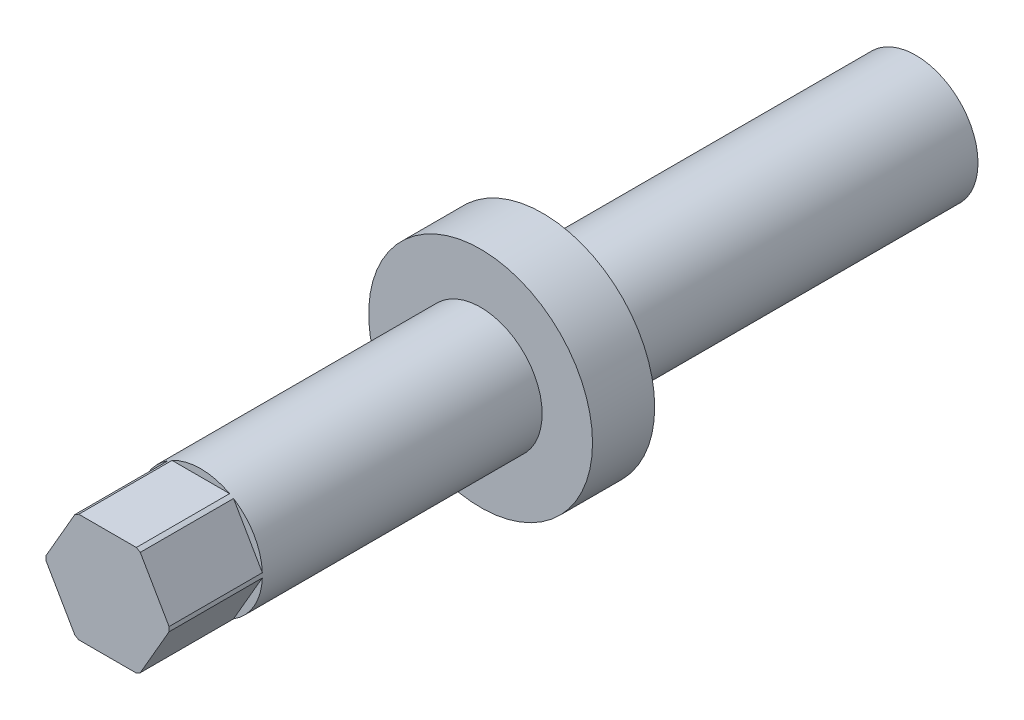
ISO-10303-21;
HEADER;
FILE_DESCRIPTION(('STEP AP214'),'2;1');
FILE_NAME('part.step','',(''),(''),'','','');
FILE_SCHEMA(('AUTOMOTIVE_DESIGN { 1 0 10303 214 1 1 1 1 }'));
ENDSEC;
DATA;
#1=APPLICATION_CONTEXT('core data for automotive mechanical design processes');
#2=APPLICATION_PROTOCOL_DEFINITION('international standard','automotive_design',2000,#1);
#3=PRODUCT_CONTEXT('',#1,'mechanical');
#4=PRODUCT('Part','Part','',(#3));
#5=PRODUCT_RELATED_PRODUCT_CATEGORY('part','',(#4));
#6=PRODUCT_DEFINITION_FORMATION('','',#4);
#7=PRODUCT_DEFINITION_CONTEXT('part definition',#1,'design');
#8=PRODUCT_DEFINITION('design','',#6,#7);
#9=PRODUCT_DEFINITION_SHAPE('','',#8);
#10=(LENGTH_UNIT() NAMED_UNIT(*) SI_UNIT(.MILLI.,.METRE.));
#11=(NAMED_UNIT(*) PLANE_ANGLE_UNIT() SI_UNIT($,.RADIAN.));
#12=(NAMED_UNIT(*) SI_UNIT($,.STERADIAN.) SOLID_ANGLE_UNIT());
#13=UNCERTAINTY_MEASURE_WITH_UNIT(LENGTH_MEASURE(1.E-05),#10,'distance_accuracy_value','');
#14=(GEOMETRIC_REPRESENTATION_CONTEXT(3) GLOBAL_UNCERTAINTY_ASSIGNED_CONTEXT((#13)) GLOBAL_UNIT_ASSIGNED_CONTEXT((#10,
#11,#12)) REPRESENTATION_CONTEXT('',''));
#15=CARTESIAN_POINT('',(0.,0.,0.));
#16=DIRECTION('',(0.,0.,1.));
#17=DIRECTION('',(1.,0.,0.));
#18=AXIS2_PLACEMENT_3D('',#15,#16,#17);
#19=CARTESIAN_POINT('',(0.,0.,0.));
#20=DIRECTION('',(0.,0.,-1.));
#21=DIRECTION('',(-1.,0.,0.));
#22=AXIS2_PLACEMENT_3D('',#19,#20,#21);
#23=PLANE('',#22);
#24=DIRECTION('',(-1.,0.,0.));
#25=VECTOR('',#24,1.);
#26=CARTESIAN_POINT('',(0.,5.55625,0.));
#27=LINE('',#26,#25);
#28=CARTESIAN_POINT('',(2.9407768000139,5.55625,0.));
#29=VERTEX_POINT('',#28);
#30=CARTESIAN_POINT('',(-2.9407768000139,5.55625,0.));
#31=VERTEX_POINT('',#30);
#32=EDGE_CURVE('E148',#29,#31,#27,.T.);
#33=ORIENTED_EDGE('',*,*,#32,.T.);
#34=CARTESIAN_POINT('',(0.,0.,0.));
#35=DIRECTION('',(0.,0.,1.));
#36=DIRECTION('',(1.,0.,0.));
#37=AXIS2_PLACEMENT_3D('',#34,#35,#36);
#38=CIRCLE('',#37,6.2865);
#39=CARTESIAN_POINT('',(-3.34146524977034,5.32491241567195,0.));
#40=VERTEX_POINT('',#39);
#41=EDGE_CURVE('E157',#31,#40,#38,.T.);
#42=ORIENTED_EDGE('',*,*,#41,.T.);
#43=DIRECTION('',(-0.5,-0.866025403784439,0.));
#44=VECTOR('',#43,1.);
#45=CARTESIAN_POINT('',(-4.81185364977729,2.778125,0.));
#46=LINE('',#45,#44);
#47=CARTESIAN_POINT('',(-6.28224204978424,0.231337584328054,0.));
#48=VERTEX_POINT('',#47);
#49=EDGE_CURVE('E168',#40,#48,#46,.T.);
#50=ORIENTED_EDGE('',*,*,#49,.T.);
#51=CARTESIAN_POINT('',(-6.28224204978424,-0.231337584328047,0.));
#52=VERTEX_POINT('',#51);
#53=EDGE_CURVE('E273',#48,#52,#38,.T.);
#54=ORIENTED_EDGE('',*,*,#53,.T.);
#55=DIRECTION('',(0.5,-0.866025403784439,0.));
#56=VECTOR('',#55,1.);
#57=CARTESIAN_POINT('',(-4.81185364977729,-2.778125,0.));
#58=LINE('',#57,#56);
#59=CARTESIAN_POINT('',(-3.34146524977034,-5.32491241567195,0.));
#60=VERTEX_POINT('',#59);
#61=EDGE_CURVE('E175',#52,#60,#58,.T.);
#62=ORIENTED_EDGE('',*,*,#61,.T.);
#63=CARTESIAN_POINT('',(-2.9407768000139,-5.55625,0.));
#64=VERTEX_POINT('',#63);
#65=EDGE_CURVE('E275',#60,#64,#38,.T.);
#66=ORIENTED_EDGE('',*,*,#65,.T.);
#67=DIRECTION('',(1.,0.,0.));
#68=VECTOR('',#67,1.);
#69=CARTESIAN_POINT('',(0.,-5.55625,0.));
#70=LINE('',#69,#68);
#71=CARTESIAN_POINT('',(2.9407768000139,-5.55625,0.));
#72=VERTEX_POINT('',#71);
#73=EDGE_CURVE('E207',#64,#72,#70,.T.);
#74=ORIENTED_EDGE('',*,*,#73,.T.);
#75=CARTESIAN_POINT('',(3.34146524977034,-5.32491241567195,0.));
#76=VERTEX_POINT('',#75);
#77=EDGE_CURVE('E233',#72,#76,#38,.T.);
#78=ORIENTED_EDGE('',*,*,#77,.T.);
#79=DIRECTION('',(0.5,0.866025403784439,0.));
#80=VECTOR('',#79,1.);
#81=CARTESIAN_POINT('',(4.81185364977729,-2.778125,0.));
#82=LINE('',#81,#80);
#83=CARTESIAN_POINT('',(6.28224204978424,-0.231337584328054,0.));
#84=VERTEX_POINT('',#83);
#85=EDGE_CURVE('E194',#76,#84,#82,.T.);
#86=ORIENTED_EDGE('',*,*,#85,.T.);
#87=CARTESIAN_POINT('',(6.28224204978424,0.231337584328056,0.));
#88=VERTEX_POINT('',#87);
#89=EDGE_CURVE('E230',#84,#88,#38,.T.);
#90=ORIENTED_EDGE('',*,*,#89,.T.);
#91=DIRECTION('',(-0.5,0.866025403784439,0.));
#92=VECTOR('',#91,1.);
#93=CARTESIAN_POINT('',(4.81185364977729,2.778125,0.));
#94=LINE('',#93,#92);
#95=CARTESIAN_POINT('',(3.34146524977034,5.32491241567195,0.));
#96=VERTEX_POINT('',#95);
#97=EDGE_CURVE('E180',#88,#96,#94,.T.);
#98=ORIENTED_EDGE('',*,*,#97,.T.);
#99=EDGE_CURVE('E234',#96,#29,#38,.T.);
#100=ORIENTED_EDGE('',*,*,#99,.T.);
#101=EDGE_LOOP('',(#33,#42,#50,#54,#62,#66,#74,#78,#86,#90,#98,#100));
#102=FACE_BOUND('',#101,.T.);
#103=ADVANCED_FACE('F51',(#102),#23,.F.);
#104=CARTESIAN_POINT('',(0.,0.,0.));
#105=DIRECTION('',(0.,0.,1.));
#106=DIRECTION('',(1.,0.,0.));
#107=AXIS2_PLACEMENT_3D('',#104,#105,#106);
#108=CYLINDRICAL_SURFACE('',#107,6.2865);
#109=CARTESIAN_POINT('',(0.,0.,-38.1));
#110=DIRECTION('',(0.,0.,1.));
#111=DIRECTION('',(1.,0.,0.));
#112=AXIS2_PLACEMENT_3D('',#109,#110,#111);
#113=CIRCLE('',#112,6.2865);
#114=CARTESIAN_POINT('',(6.2865,0.,-38.1));
#115=VERTEX_POINT('',#114);
#116=EDGE_CURVE('E235',#115,#115,#113,.T.);
#117=ORIENTED_EDGE('',*,*,#116,.T.);
#118=EDGE_LOOP('',(#117));
#119=FACE_BOUND('',#118,.T.);
#120=DIRECTION('',(0.,0.,1.));
#121=VECTOR('',#120,1.);
#122=CARTESIAN_POINT('',(-2.9407768000139,5.55625,-9.525));
#123=LINE('',#122,#121);
#124=CARTESIAN_POINT('',(-2.9407768000139,5.55625,-9.525));
#125=VERTEX_POINT('',#124);
#126=EDGE_CURVE('E142',#125,#31,#123,.T.);
#127=ORIENTED_EDGE('',*,*,#126,.F.);
#128=CARTESIAN_POINT('',(0.,0.,-9.525));
#129=DIRECTION('',(0.,0.,1.));
#130=DIRECTION('',(1.,0.,0.));
#131=AXIS2_PLACEMENT_3D('',#128,#129,#130);
#132=CIRCLE('',#131,6.2865);
#133=CARTESIAN_POINT('',(2.9407768000139,5.55625,-9.525));
#134=VERTEX_POINT('',#133);
#135=EDGE_CURVE('E147',#134,#125,#132,.T.);
#136=ORIENTED_EDGE('',*,*,#135,.F.);
#137=DIRECTION('',(0.,0.,1.));
#138=VECTOR('',#137,1.);
#139=CARTESIAN_POINT('',(2.9407768000139,5.55625,-9.525));
#140=LINE('',#139,#138);
#141=EDGE_CURVE('E145',#134,#29,#140,.T.);
#142=ORIENTED_EDGE('',*,*,#141,.T.);
#143=ORIENTED_EDGE('',*,*,#99,.F.);
#144=DIRECTION('',(0.,0.,1.));
#145=VECTOR('',#144,1.);
#146=CARTESIAN_POINT('',(3.34146524977034,5.32491241567195,-9.525));
#147=LINE('',#146,#145);
#148=CARTESIAN_POINT('',(3.34146524977034,5.32491241567195,-9.525));
#149=VERTEX_POINT('',#148);
#150=EDGE_CURVE('E187',#149,#96,#147,.T.);
#151=ORIENTED_EDGE('',*,*,#150,.F.);
#152=CARTESIAN_POINT('',(0.,0.,-9.525));
#153=DIRECTION('',(0.,0.,1.));
#154=DIRECTION('',(1.,0.,0.));
#155=AXIS2_PLACEMENT_3D('',#152,#153,#154);
#156=CIRCLE('',#155,6.2865);
#157=CARTESIAN_POINT('',(6.28224204978424,0.231337584328056,-9.525));
#158=VERTEX_POINT('',#157);
#159=EDGE_CURVE('E179',#158,#149,#156,.T.);
#160=ORIENTED_EDGE('',*,*,#159,.F.);
#161=DIRECTION('',(0.,0.,1.));
#162=VECTOR('',#161,1.);
#163=CARTESIAN_POINT('',(6.28224204978424,0.231337584328056,-9.525));
#164=LINE('',#163,#162);
#165=EDGE_CURVE('E183',#158,#88,#164,.T.);
#166=ORIENTED_EDGE('',*,*,#165,.T.);
#167=ORIENTED_EDGE('',*,*,#89,.F.);
#168=DIRECTION('',(0.,0.,1.));
#169=VECTOR('',#168,1.);
#170=CARTESIAN_POINT('',(6.28224204978424,-0.231337584328054,-9.525));
#171=LINE('',#170,#169);
#172=CARTESIAN_POINT('',(6.28224204978424,-0.231337584328054,-9.525));
#173=VERTEX_POINT('',#172);
#174=EDGE_CURVE('E186',#173,#84,#171,.T.);
#175=ORIENTED_EDGE('',*,*,#174,.F.);
#176=CARTESIAN_POINT('',(0.,0.,-9.525));
#177=DIRECTION('',(0.,0.,1.));
#178=DIRECTION('',(1.,0.,0.));
#179=AXIS2_PLACEMENT_3D('',#176,#177,#178);
#180=CIRCLE('',#179,6.2865);
#181=CARTESIAN_POINT('',(3.34146524977034,-5.32491241567195,-9.525));
#182=VERTEX_POINT('',#181);
#183=EDGE_CURVE('E193',#182,#173,#180,.T.);
#184=ORIENTED_EDGE('',*,*,#183,.F.);
#185=DIRECTION('',(0.,0.,1.));
#186=VECTOR('',#185,1.);
#187=CARTESIAN_POINT('',(3.34146524977034,-5.32491241567195,-9.525));
#188=LINE('',#187,#186);
#189=EDGE_CURVE('E197',#182,#76,#188,.T.);
#190=ORIENTED_EDGE('',*,*,#189,.T.);
#191=ORIENTED_EDGE('',*,*,#77,.F.);
#192=DIRECTION('',(0.,0.,1.));
#193=VECTOR('',#192,1.);
#194=CARTESIAN_POINT('',(2.9407768000139,-5.55625,-9.525));
#195=LINE('',#194,#193);
#196=CARTESIAN_POINT('',(2.9407768000139,-5.55625,-9.525));
#197=VERTEX_POINT('',#196);
#198=EDGE_CURVE('E200',#197,#72,#195,.T.);
#199=ORIENTED_EDGE('',*,*,#198,.F.);
#200=CARTESIAN_POINT('',(0.,0.,-9.525));
#201=DIRECTION('',(0.,0.,1.));
#202=DIRECTION('',(1.,0.,0.));
#203=AXIS2_PLACEMENT_3D('',#200,#201,#202);
#204=CIRCLE('',#203,6.2865);
#205=CARTESIAN_POINT('',(-2.9407768000139,-5.55625,-9.525));
#206=VERTEX_POINT('',#205);
#207=EDGE_CURVE('E206',#206,#197,#204,.T.);
#208=ORIENTED_EDGE('',*,*,#207,.F.);
#209=DIRECTION('',(0.,0.,1.));
#210=VECTOR('',#209,1.);
#211=CARTESIAN_POINT('',(-2.9407768000139,-5.55625,-9.525));
#212=LINE('',#211,#210);
#213=EDGE_CURVE('E210',#206,#64,#212,.T.);
#214=ORIENTED_EDGE('',*,*,#213,.T.);
#215=ORIENTED_EDGE('',*,*,#65,.F.);
#216=DIRECTION('',(0.,0.,1.));
#217=VECTOR('',#216,1.);
#218=CARTESIAN_POINT('',(-3.34146524977034,-5.32491241567195,-9.525));
#219=LINE('',#218,#217);
#220=CARTESIAN_POINT('',(-3.34146524977034,-5.32491241567195,-9.525));
#221=VERTEX_POINT('',#220);
#222=EDGE_CURVE('E213',#221,#60,#219,.T.);
#223=ORIENTED_EDGE('',*,*,#222,.F.);
#224=CARTESIAN_POINT('',(0.,0.,-9.525));
#225=DIRECTION('',(0.,0.,1.));
#226=DIRECTION('',(1.,0.,0.));
#227=AXIS2_PLACEMENT_3D('',#224,#225,#226);
#228=CIRCLE('',#227,6.2865);
#229=CARTESIAN_POINT('',(-6.28224204978424,-0.231337584328047,-9.525));
#230=VERTEX_POINT('',#229);
#231=EDGE_CURVE('E219',#230,#221,#228,.T.);
#232=ORIENTED_EDGE('',*,*,#231,.F.);
#233=DIRECTION('',(0.,0.,1.));
#234=VECTOR('',#233,1.);
#235=CARTESIAN_POINT('',(-6.28224204978424,-0.231337584328047,-9.525));
#236=LINE('',#235,#234);
#237=EDGE_CURVE('E222',#230,#52,#236,.T.);
#238=ORIENTED_EDGE('',*,*,#237,.T.);
#239=ORIENTED_EDGE('',*,*,#53,.F.);
#240=DIRECTION('',(0.,0.,1.));
#241=VECTOR('',#240,1.);
#242=CARTESIAN_POINT('',(-6.28224204978424,0.231337584328054,-9.525));
#243=LINE('',#242,#241);
#244=CARTESIAN_POINT('',(-6.28224204978424,0.231337584328054,-9.525));
#245=VERTEX_POINT('',#244);
#246=EDGE_CURVE('E173',#245,#48,#243,.T.);
#247=ORIENTED_EDGE('',*,*,#246,.F.);
#248=CARTESIAN_POINT('',(0.,0.,-9.525));
#249=DIRECTION('',(0.,0.,1.));
#250=DIRECTION('',(1.,0.,0.));
#251=AXIS2_PLACEMENT_3D('',#248,#249,#250);
#252=CIRCLE('',#251,6.2865);
#253=CARTESIAN_POINT('',(-3.34146524977034,5.32491241567195,-9.525));
#254=VERTEX_POINT('',#253);
#255=EDGE_CURVE('E167',#254,#245,#252,.T.);
#256=ORIENTED_EDGE('',*,*,#255,.F.);
#257=DIRECTION('',(0.,0.,1.));
#258=VECTOR('',#257,1.);
#259=CARTESIAN_POINT('',(-3.34146524977034,5.32491241567195,-9.525));
#260=LINE('',#259,#258);
#261=EDGE_CURVE('E170',#254,#40,#260,.T.);
#262=ORIENTED_EDGE('',*,*,#261,.T.);
#263=ORIENTED_EDGE('',*,*,#41,.F.);
#264=EDGE_LOOP('',(#127,#136,#142,#143,#151,#160,#166,#167,#175,#184,#190,#191,#199,#208,#214,
#215,#223,#232,#238,#239,#247,#256,#262,#263));
#265=FACE_BOUND('',#264,.T.);
#266=ADVANCED_FACE('F154',(#119,#265),#108,.T.);
#267=CARTESIAN_POINT('',(0.,0.,-82.55));
#268=DIRECTION('',(0.,0.,1.));
#269=DIRECTION('',(1.,0.,0.));
#270=AXIS2_PLACEMENT_3D('',#267,#268,#269);
#271=PLANE('',#270);
#272=CARTESIAN_POINT('',(0.,0.,-82.55));
#273=DIRECTION('',(0.,0.,-1.));
#274=DIRECTION('',(-1.,0.,0.));
#275=AXIS2_PLACEMENT_3D('',#272,#273,#274);
#276=CIRCLE('',#275,2.55269999999999);
#277=CARTESIAN_POINT('',(-2.55269999999999,0.,-82.55));
#278=VERTEX_POINT('',#277);
#279=EDGE_CURVE('E158',#278,#278,#276,.T.);
#280=ORIENTED_EDGE('',*,*,#279,.F.);
#281=EDGE_LOOP('',(#280));
#282=FACE_BOUND('',#281,.T.);
#283=CARTESIAN_POINT('',(0.,0.,-82.55));
#284=DIRECTION('',(0.,0.,1.));
#285=DIRECTION('',(1.,0.,0.));
#286=AXIS2_PLACEMENT_3D('',#283,#284,#285);
#287=CIRCLE('',#286,6.35);
#288=CARTESIAN_POINT('',(6.35,0.,-82.55));
#289=VERTEX_POINT('',#288);
#290=EDGE_CURVE('E11',#289,#289,#287,.T.);
#291=ORIENTED_EDGE('',*,*,#290,.F.);
#292=EDGE_LOOP('',(#291));
#293=FACE_BOUND('',#292,.T.);
#294=ADVANCED_FACE('F251',(#282,#293),#271,.F.);
#295=CARTESIAN_POINT('',(0.,0.,0.));
#296=DIRECTION('',(0.,0.,1.));
#297=DIRECTION('',(1.,0.,0.));
#298=AXIS2_PLACEMENT_3D('',#295,#296,#297);
#299=CYLINDRICAL_SURFACE('',#298,6.35);
#300=CARTESIAN_POINT('',(0.,0.,-44.45));
#301=DIRECTION('',(0.,0.,1.));
#302=DIRECTION('',(1.,0.,0.));
#303=AXIS2_PLACEMENT_3D('',#300,#301,#302);
#304=CIRCLE('',#303,6.35);
#305=CARTESIAN_POINT('',(6.35,0.,-44.45));
#306=VERTEX_POINT('',#305);
#307=EDGE_CURVE('E58',#306,#306,#304,.T.);
#308=ORIENTED_EDGE('',*,*,#307,.F.);
#309=EDGE_LOOP('',(#308));
#310=FACE_BOUND('',#309,.T.);
#311=ORIENTED_EDGE('',*,*,#290,.T.);
#312=EDGE_LOOP('',(#311));
#313=FACE_BOUND('',#312,.T.);
#314=ADVANCED_FACE('F248',(#310,#313),#299,.T.);
#315=CARTESIAN_POINT('',(0.,0.,-44.45));
#316=DIRECTION('',(0.,0.,1.));
#317=DIRECTION('',(1.,0.,0.));
#318=AXIS2_PLACEMENT_3D('',#315,#316,#317);
#319=PLANE('',#318);
#320=CARTESIAN_POINT('',(0.,0.,-44.45));
#321=DIRECTION('',(0.,0.,1.));
#322=DIRECTION('',(1.,0.,0.));
#323=AXIS2_PLACEMENT_3D('',#320,#321,#322);
#324=CIRCLE('',#323,11.43);
#325=CARTESIAN_POINT('',(11.43,0.,-44.45));
#326=VERTEX_POINT('',#325);
#327=EDGE_CURVE('E241',#326,#326,#324,.T.);
#328=ORIENTED_EDGE('',*,*,#327,.F.);
#329=EDGE_LOOP('',(#328));
#330=FACE_BOUND('',#329,.T.);
#331=ORIENTED_EDGE('',*,*,#307,.T.);
#332=EDGE_LOOP('',(#331));
#333=FACE_BOUND('',#332,.T.);
#334=ADVANCED_FACE('F246',(#330,#333),#319,.F.);
#335=CARTESIAN_POINT('',(0.,0.,0.));
#336=DIRECTION('',(0.,0.,1.));
#337=DIRECTION('',(1.,0.,0.));
#338=AXIS2_PLACEMENT_3D('',#335,#336,#337);
#339=CYLINDRICAL_SURFACE('',#338,11.43);
#340=CARTESIAN_POINT('',(0.,0.,-38.1));
#341=DIRECTION('',(0.,0.,1.));
#342=DIRECTION('',(1.,0.,0.));
#343=AXIS2_PLACEMENT_3D('',#340,#341,#342);
#344=CIRCLE('',#343,11.43);
#345=CARTESIAN_POINT('',(11.43,0.,-38.1));
#346=VERTEX_POINT('',#345);
#347=EDGE_CURVE('E238',#346,#346,#344,.T.);
#348=ORIENTED_EDGE('',*,*,#347,.F.);
#349=EDGE_LOOP('',(#348));
#350=FACE_BOUND('',#349,.T.);
#351=ORIENTED_EDGE('',*,*,#327,.T.);
#352=EDGE_LOOP('',(#351));
#353=FACE_BOUND('',#352,.T.);
#354=ADVANCED_FACE('F337',(#350,#353),#339,.T.);
#355=CARTESIAN_POINT('',(0.,0.,-38.1));
#356=DIRECTION('',(0.,0.,-1.));
#357=DIRECTION('',(-1.,0.,0.));
#358=AXIS2_PLACEMENT_3D('',#355,#356,#357);
#359=PLANE('',#358);
#360=ORIENTED_EDGE('',*,*,#116,.F.);
#361=EDGE_LOOP('',(#360));
#362=FACE_BOUND('',#361,.T.);
#363=ORIENTED_EDGE('',*,*,#347,.T.);
#364=EDGE_LOOP('',(#363));
#365=FACE_BOUND('',#364,.T.);
#366=ADVANCED_FACE('F332',(#362,#365),#359,.F.);
#367=CARTESIAN_POINT('',(0.,0.,-66.04));
#368=DIRECTION('',(0.,0.,-1.));
#369=DIRECTION('',(-1.,0.,0.));
#370=AXIS2_PLACEMENT_3D('',#367,#368,#369);
#371=CONICAL_SURFACE('',#370,2.55269999999999,1.02974425867665);
#372=CARTESIAN_POINT('',(0.,0.,-64.5061830978084));
#373=VERTEX_POINT('',#372);
#374=VERTEX_LOOP('',#373);
#375=FACE_BOUND('',#374,.T.);
#376=CARTESIAN_POINT('',(0.,0.,-66.04));
#377=DIRECTION('',(0.,0.,-1.));
#378=DIRECTION('',(-1.,0.,0.));
#379=AXIS2_PLACEMENT_3D('',#376,#377,#378);
#380=CIRCLE('',#379,2.55269999999999);
#381=CARTESIAN_POINT('',(-2.55269999999999,0.,-66.04));
#382=VERTEX_POINT('',#381);
#383=EDGE_CURVE('E161',#382,#382,#380,.T.);
#384=ORIENTED_EDGE('',*,*,#383,.T.);
#385=EDGE_LOOP('',(#384));
#386=FACE_BOUND('',#385,.T.);
#387=ADVANCED_FACE('F329',(#375,#386),#371,.F.);
#388=CARTESIAN_POINT('',(0.,0.,-82.55));
#389=DIRECTION('',(0.,0.,-1.));
#390=DIRECTION('',(-1.,0.,0.));
#391=AXIS2_PLACEMENT_3D('',#388,#389,#390);
#392=CYLINDRICAL_SURFACE('',#391,2.55269999999999);
#393=ORIENTED_EDGE('',*,*,#383,.F.);
#394=EDGE_LOOP('',(#393));
#395=FACE_BOUND('',#394,.T.);
#396=ORIENTED_EDGE('',*,*,#279,.T.);
#397=EDGE_LOOP('',(#396));
#398=FACE_BOUND('',#397,.T.);
#399=ADVANCED_FACE('F302',(#395,#398),#392,.F.);
#400=CARTESIAN_POINT('',(4.81185364977729,2.778125,-9.525));
#401=DIRECTION('',(0.866025403784439,0.5,0.));
#402=DIRECTION('',(-0.5,0.866025403784439,0.));
#403=AXIS2_PLACEMENT_3D('',#400,#401,#402);
#404=PLANE('',#403);
#405=ORIENTED_EDGE('',*,*,#97,.F.);
#406=ORIENTED_EDGE('',*,*,#165,.F.);
#407=DIRECTION('',(-0.5,0.866025403784439,0.));
#408=VECTOR('',#407,1.);
#409=CARTESIAN_POINT('',(4.81185364977729,2.778125,-9.525));
#410=LINE('',#409,#408);
#411=EDGE_CURVE('E177',#158,#149,#410,.T.);
#412=ORIENTED_EDGE('',*,*,#411,.T.);
#413=ORIENTED_EDGE('',*,*,#150,.T.);
#414=EDGE_LOOP('',(#405,#406,#412,#413));
#415=FACE_BOUND('',#414,.T.);
#416=ADVANCED_FACE('F291',(#415),#404,.T.);
#417=CARTESIAN_POINT('',(0.,0.,-9.525));
#418=DIRECTION('',(0.,0.,1.));
#419=DIRECTION('',(1.,0.,0.));
#420=AXIS2_PLACEMENT_3D('',#417,#418,#419);
#421=PLANE('',#420);
#422=ORIENTED_EDGE('',*,*,#411,.F.);
#423=ORIENTED_EDGE('',*,*,#159,.T.);
#424=EDGE_LOOP('',(#422,#423));
#425=FACE_BOUND('',#424,.T.);
#426=ADVANCED_FACE('F293',(#425),#421,.T.);
#427=CARTESIAN_POINT('',(4.81185364977729,-2.778125,-9.525));
#428=DIRECTION('',(0.866025403784439,-0.5,0.));
#429=DIRECTION('',(0.5,0.866025403784439,0.));
#430=AXIS2_PLACEMENT_3D('',#427,#428,#429);
#431=PLANE('',#430);
#432=ORIENTED_EDGE('',*,*,#85,.F.);
#433=ORIENTED_EDGE('',*,*,#189,.F.);
#434=DIRECTION('',(0.5,0.866025403784439,0.));
#435=VECTOR('',#434,1.);
#436=CARTESIAN_POINT('',(4.81185364977729,-2.778125,-9.525));
#437=LINE('',#436,#435);
#438=EDGE_CURVE('E191',#182,#173,#437,.T.);
#439=ORIENTED_EDGE('',*,*,#438,.T.);
#440=ORIENTED_EDGE('',*,*,#174,.T.);
#441=EDGE_LOOP('',(#432,#433,#439,#440));
#442=FACE_BOUND('',#441,.T.);
#443=ADVANCED_FACE('F288',(#442),#431,.T.);
#444=CARTESIAN_POINT('',(0.,0.,-9.525));
#445=DIRECTION('',(0.,0.,1.));
#446=DIRECTION('',(1.,0.,0.));
#447=AXIS2_PLACEMENT_3D('',#444,#445,#446);
#448=PLANE('',#447);
#449=ORIENTED_EDGE('',*,*,#438,.F.);
#450=ORIENTED_EDGE('',*,*,#183,.T.);
#451=EDGE_LOOP('',(#449,#450));
#452=FACE_BOUND('',#451,.T.);
#453=ADVANCED_FACE('F300',(#452),#448,.T.);
#454=CARTESIAN_POINT('',(0.,-5.55625,-9.525));
#455=DIRECTION('',(0.,-1.,0.));
#456=DIRECTION('',(0.,0.,-1.));
#457=AXIS2_PLACEMENT_3D('',#454,#455,#456);
#458=PLANE('',#457);
#459=ORIENTED_EDGE('',*,*,#73,.F.);
#460=ORIENTED_EDGE('',*,*,#213,.F.);
#461=DIRECTION('',(1.,0.,0.));
#462=VECTOR('',#461,1.);
#463=CARTESIAN_POINT('',(0.,-5.55625,-9.525));
#464=LINE('',#463,#462);
#465=EDGE_CURVE('E204',#206,#197,#464,.T.);
#466=ORIENTED_EDGE('',*,*,#465,.T.);
#467=ORIENTED_EDGE('',*,*,#198,.T.);
#468=EDGE_LOOP('',(#459,#460,#466,#467));
#469=FACE_BOUND('',#468,.T.);
#470=ADVANCED_FACE('F309',(#469),#458,.T.);
#471=CARTESIAN_POINT('',(0.,0.,-9.525));
#472=DIRECTION('',(0.,0.,1.));
#473=DIRECTION('',(1.,0.,0.));
#474=AXIS2_PLACEMENT_3D('',#471,#472,#473);
#475=PLANE('',#474);
#476=ORIENTED_EDGE('',*,*,#465,.F.);
#477=ORIENTED_EDGE('',*,*,#207,.T.);
#478=EDGE_LOOP('',(#476,#477));
#479=FACE_BOUND('',#478,.T.);
#480=ADVANCED_FACE('F312',(#479),#475,.T.);
#481=CARTESIAN_POINT('',(-4.81185364977729,-2.778125,-9.525));
#482=DIRECTION('',(-0.866025403784439,-0.5,0.));
#483=DIRECTION('',(0.5,-0.866025403784439,0.));
#484=AXIS2_PLACEMENT_3D('',#481,#482,#483);
#485=PLANE('',#484);
#486=ORIENTED_EDGE('',*,*,#61,.F.);
#487=ORIENTED_EDGE('',*,*,#237,.F.);
#488=DIRECTION('',(0.5,-0.866025403784439,0.));
#489=VECTOR('',#488,1.);
#490=CARTESIAN_POINT('',(-4.81185364977729,-2.778125,-9.525));
#491=LINE('',#490,#489);
#492=EDGE_CURVE('E217',#230,#221,#491,.T.);
#493=ORIENTED_EDGE('',*,*,#492,.T.);
#494=ORIENTED_EDGE('',*,*,#222,.T.);
#495=EDGE_LOOP('',(#486,#487,#493,#494));
#496=FACE_BOUND('',#495,.T.);
#497=ADVANCED_FACE('F315',(#496),#485,.T.);
#498=CARTESIAN_POINT('',(0.,0.,-9.525));
#499=DIRECTION('',(0.,0.,1.));
#500=DIRECTION('',(1.,0.,0.));
#501=AXIS2_PLACEMENT_3D('',#498,#499,#500);
#502=PLANE('',#501);
#503=ORIENTED_EDGE('',*,*,#492,.F.);
#504=ORIENTED_EDGE('',*,*,#231,.T.);
#505=EDGE_LOOP('',(#503,#504));
#506=FACE_BOUND('',#505,.T.);
#507=ADVANCED_FACE('F320',(#506),#502,.T.);
#508=CARTESIAN_POINT('',(-4.81185364977729,2.778125,-9.525));
#509=DIRECTION('',(-0.866025403784439,0.5,0.));
#510=DIRECTION('',(-0.5,-0.866025403784438,0.));
#511=AXIS2_PLACEMENT_3D('',#508,#509,#510);
#512=PLANE('',#511);
#513=ORIENTED_EDGE('',*,*,#49,.F.);
#514=ORIENTED_EDGE('',*,*,#261,.F.);
#515=DIRECTION('',(-0.5,-0.866025403784439,0.));
#516=VECTOR('',#515,1.);
#517=CARTESIAN_POINT('',(-4.81185364977729,2.778125,-9.525));
#518=LINE('',#517,#516);
#519=EDGE_CURVE('E71',#254,#245,#518,.T.);
#520=ORIENTED_EDGE('',*,*,#519,.T.);
#521=ORIENTED_EDGE('',*,*,#246,.T.);
#522=EDGE_LOOP('',(#513,#514,#520,#521));
#523=FACE_BOUND('',#522,.T.);
#524=ADVANCED_FACE('F305',(#523),#512,.T.);
#525=CARTESIAN_POINT('',(0.,0.,-9.525));
#526=DIRECTION('',(0.,0.,1.));
#527=DIRECTION('',(1.,0.,0.));
#528=AXIS2_PLACEMENT_3D('',#525,#526,#527);
#529=PLANE('',#528);
#530=ORIENTED_EDGE('',*,*,#519,.F.);
#531=ORIENTED_EDGE('',*,*,#255,.T.);
#532=EDGE_LOOP('',(#530,#531));
#533=FACE_BOUND('',#532,.T.);
#534=ADVANCED_FACE('F449',(#533),#529,.T.);
#535=CARTESIAN_POINT('',(0.,5.55625,-9.525));
#536=DIRECTION('',(0.,1.,0.));
#537=DIRECTION('',(-1.,0.,0.));
#538=AXIS2_PLACEMENT_3D('',#535,#536,#537);
#539=PLANE('',#538);
#540=ORIENTED_EDGE('',*,*,#32,.F.);
#541=ORIENTED_EDGE('',*,*,#141,.F.);
#542=DIRECTION('',(-1.,0.,0.));
#543=VECTOR('',#542,1.);
#544=CARTESIAN_POINT('',(0.,5.55625,-9.525));
#545=LINE('',#544,#543);
#546=EDGE_CURVE('E64',#134,#125,#545,.T.);
#547=ORIENTED_EDGE('',*,*,#546,.T.);
#548=ORIENTED_EDGE('',*,*,#126,.T.);
#549=EDGE_LOOP('',(#540,#541,#547,#548));
#550=FACE_BOUND('',#549,.T.);
#551=ADVANCED_FACE('F140',(#550),#539,.T.);
#552=CARTESIAN_POINT('',(0.,0.,-9.525));
#553=DIRECTION('',(0.,0.,1.));
#554=DIRECTION('',(1.,0.,0.));
#555=AXIS2_PLACEMENT_3D('',#552,#553,#554);
#556=PLANE('',#555);
#557=ORIENTED_EDGE('',*,*,#546,.F.);
#558=ORIENTED_EDGE('',*,*,#135,.T.);
#559=EDGE_LOOP('',(#557,#558));
#560=FACE_BOUND('',#559,.T.);
#561=ADVANCED_FACE('F150',(#560),#556,.T.);
#562=CLOSED_SHELL('',(#103,#266,#294,#314,#334,#354,#366,#387,#399,#416,#426,#443,#453,#470,
#480,#497,#507,#524,#534,#551,#561));
#563=MANIFOLD_SOLID_BREP('B2',#562);
#564=ADVANCED_BREP_SHAPE_REPRESENTATION('',(#18,#563),#14);
#565=SHAPE_DEFINITION_REPRESENTATION(#9,#564);
ENDSEC;
END-ISO-10303-21;
